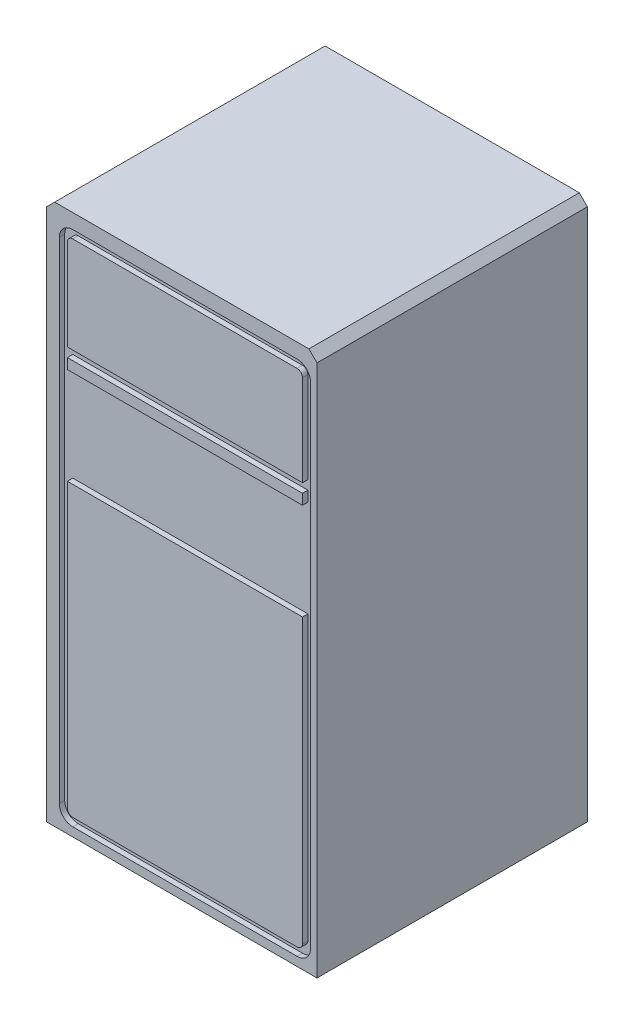
ISO-10303-21;
HEADER;
FILE_DESCRIPTION(('STEP AP214'),'2;1');
FILE_NAME('part.step','',(''),(''),'','','');
FILE_SCHEMA(('AUTOMOTIVE_DESIGN { 1 0 10303 214 1 1 1 1 }'));
ENDSEC;
DATA;
#1=APPLICATION_CONTEXT('core data for automotive mechanical design processes');
#2=APPLICATION_PROTOCOL_DEFINITION('international standard','automotive_design',2000,#1);
#3=PRODUCT_CONTEXT('',#1,'mechanical');
#4=PRODUCT('Part','Part','',(#3));
#5=PRODUCT_RELATED_PRODUCT_CATEGORY('part','',(#4));
#6=PRODUCT_DEFINITION_FORMATION('','',#4);
#7=PRODUCT_DEFINITION_CONTEXT('part definition',#1,'design');
#8=PRODUCT_DEFINITION('design','',#6,#7);
#9=PRODUCT_DEFINITION_SHAPE('','',#8);
#10=(LENGTH_UNIT() NAMED_UNIT(*) SI_UNIT(.MILLI.,.METRE.));
#11=(NAMED_UNIT(*) PLANE_ANGLE_UNIT() SI_UNIT($,.RADIAN.));
#12=(NAMED_UNIT(*) SI_UNIT($,.STERADIAN.) SOLID_ANGLE_UNIT());
#13=UNCERTAINTY_MEASURE_WITH_UNIT(LENGTH_MEASURE(1.E-05),#10,'distance_accuracy_value','');
#14=(GEOMETRIC_REPRESENTATION_CONTEXT(3) GLOBAL_UNCERTAINTY_ASSIGNED_CONTEXT((#13)) GLOBAL_UNIT_ASSIGNED_CONTEXT((#10,
#11,#12)) REPRESENTATION_CONTEXT('',''));
#15=CARTESIAN_POINT('',(0.,0.,0.));
#16=DIRECTION('',(0.,0.,1.));
#17=DIRECTION('',(1.,0.,0.));
#18=AXIS2_PLACEMENT_3D('',#15,#16,#17);
#19=CARTESIAN_POINT('',(446.238550510599,1895.51273196442,480.));
#20=DIRECTION('',(1.,0.,0.));
#21=DIRECTION('',(0.,1.,0.));
#22=AXIS2_PLACEMENT_3D('',#19,#20,#21);
#23=PLANE('',#22);
#24=DIRECTION('',(0.,0.,1.));
#25=VECTOR('',#24,1.);
#26=CARTESIAN_POINT('',(446.238550510599,1559.36179810981,480.));
#27=LINE('',#26,#25);
#28=CARTESIAN_POINT('',(446.238550510599,1559.36179810981,480.));
#29=VERTEX_POINT('',#28);
#30=CARTESIAN_POINT('',(446.238550510599,1559.36179810981,500.));
#31=VERTEX_POINT('',#30);
#32=EDGE_CURVE('E518',#29,#31,#27,.T.);
#33=ORIENTED_EDGE('',*,*,#32,.F.);
#34=DIRECTION('',(0.,1.,0.));
#35=VECTOR('',#34,1.);
#36=CARTESIAN_POINT('',(446.238550510599,1895.51273196442,480.));
#37=LINE('',#36,#35);
#38=CARTESIAN_POINT('',(446.238550510599,1895.51273196442,480.));
#39=VERTEX_POINT('',#38);
#40=EDGE_CURVE('E267',#29,#39,#37,.T.);
#41=ORIENTED_EDGE('',*,*,#40,.T.);
#42=DIRECTION('',(0.,0.,1.));
#43=VECTOR('',#42,1.);
#44=CARTESIAN_POINT('',(446.238550510599,1895.51273196442,480.));
#45=LINE('',#44,#43);
#46=CARTESIAN_POINT('',(446.238550510599,1895.51273196442,500.));
#47=VERTEX_POINT('',#46);
#48=EDGE_CURVE('E301',#39,#47,#45,.T.);
#49=ORIENTED_EDGE('',*,*,#48,.T.);
#50=DIRECTION('',(0.,1.,0.));
#51=VECTOR('',#50,1.);
#52=CARTESIAN_POINT('',(446.238550510599,1895.51273196442,500.));
#53=LINE('',#52,#51);
#54=EDGE_CURVE('E287',#31,#47,#53,.T.);
#55=ORIENTED_EDGE('',*,*,#54,.F.);
#56=EDGE_LOOP('',(#33,#41,#49,#55));
#57=FACE_BOUND('',#56,.T.);
#58=ADVANCED_FACE('F35',(#57),#23,.T.);
#59=CARTESIAN_POINT('',(-423.105485688733,1895.51273196442,480.));
#60=DIRECTION('',(-1.,0.,0.));
#61=DIRECTION('',(0.,-1.,0.));
#62=AXIS2_PLACEMENT_3D('',#59,#60,#61);
#63=PLANE('',#62);
#64=DIRECTION('',(0.,0.,1.));
#65=VECTOR('',#64,1.);
#66=CARTESIAN_POINT('',(-423.105485688733,1559.36179810981,480.));
#67=LINE('',#66,#65);
#68=CARTESIAN_POINT('',(-423.105485688733,1559.36179810981,480.));
#69=VERTEX_POINT('',#68);
#70=CARTESIAN_POINT('',(-423.105485688733,1559.36179810981,500.));
#71=VERTEX_POINT('',#70);
#72=EDGE_CURVE('E280',#69,#71,#67,.T.);
#73=ORIENTED_EDGE('',*,*,#72,.T.);
#74=DIRECTION('',(0.,-1.,0.));
#75=VECTOR('',#74,1.);
#76=CARTESIAN_POINT('',(-423.105485688733,1895.51273196442,500.));
#77=LINE('',#76,#75);
#78=CARTESIAN_POINT('',(-423.105485688733,1895.51273196442,500.));
#79=VERTEX_POINT('',#78);
#80=EDGE_CURVE('E281',#79,#71,#77,.T.);
#81=ORIENTED_EDGE('',*,*,#80,.F.);
#82=DIRECTION('',(0.,0.,1.));
#83=VECTOR('',#82,1.);
#84=CARTESIAN_POINT('',(-423.105485688733,1895.51273196442,480.));
#85=LINE('',#84,#83);
#86=CARTESIAN_POINT('',(-423.105485688733,1895.51273196442,480.));
#87=VERTEX_POINT('',#86);
#88=EDGE_CURVE('E276',#87,#79,#85,.T.);
#89=ORIENTED_EDGE('',*,*,#88,.F.);
#90=DIRECTION('',(0.,-1.,0.));
#91=VECTOR('',#90,1.);
#92=CARTESIAN_POINT('',(-423.105485688733,1895.51273196442,480.));
#93=LINE('',#92,#91);
#94=EDGE_CURVE('E258',#87,#69,#93,.T.);
#95=ORIENTED_EDGE('',*,*,#94,.T.);
#96=EDGE_LOOP('',(#73,#81,#89,#95));
#97=FACE_BOUND('',#96,.T.);
#98=ADVANCED_FACE('F490',(#97),#63,.T.);
#99=CARTESIAN_POINT('',(-500.,2000.,500.));
#100=DIRECTION('',(0.,0.,-1.));
#101=DIRECTION('',(-1.,0.,0.));
#102=AXIS2_PLACEMENT_3D('',#99,#100,#101);
#103=PLANE('',#102);
#104=ORIENTED_EDGE('',*,*,#80,.T.);
#105=DIRECTION('',(-1.,0.,0.));
#106=VECTOR('',#105,1.);
#107=CARTESIAN_POINT('',(-423.105485688733,1559.36179810981,500.));
#108=LINE('',#107,#106);
#109=EDGE_CURVE('E243',#31,#71,#108,.T.);
#110=ORIENTED_EDGE('',*,*,#109,.F.);
#111=ORIENTED_EDGE('',*,*,#54,.T.);
#112=CARTESIAN_POINT('',(426.238550510599,1895.51273196442,500.));
#113=DIRECTION('',(0.,0.,1.));
#114=DIRECTION('',(-1.,0.,0.));
#115=AXIS2_PLACEMENT_3D('',#112,#113,#114);
#116=CIRCLE('',#115,20.);
#117=CARTESIAN_POINT('',(426.238550510599,1915.51273196442,500.));
#118=VERTEX_POINT('',#117);
#119=EDGE_CURVE('E291',#47,#118,#116,.T.);
#120=ORIENTED_EDGE('',*,*,#119,.T.);
#121=DIRECTION('',(-1.,0.,0.));
#122=VECTOR('',#121,1.);
#123=CARTESIAN_POINT('',(-403.105485688733,1915.51273196442,500.));
#124=LINE('',#123,#122);
#125=CARTESIAN_POINT('',(-403.105485688733,1915.51273196442,500.));
#126=VERTEX_POINT('',#125);
#127=EDGE_CURVE('E263',#118,#126,#124,.T.);
#128=ORIENTED_EDGE('',*,*,#127,.T.);
#129=CARTESIAN_POINT('',(-403.105485688733,1895.51273196442,500.));
#130=DIRECTION('',(0.,0.,1.));
#131=DIRECTION('',(1.,0.,0.));
#132=AXIS2_PLACEMENT_3D('',#129,#130,#131);
#133=CIRCLE('',#132,20.);
#134=EDGE_CURVE('E277',#126,#79,#133,.T.);
#135=ORIENTED_EDGE('',*,*,#134,.T.);
#136=EDGE_LOOP('',(#104,#110,#111,#120,#128,#135));
#137=FACE_BOUND('',#136,.T.);
#138=ADVANCED_FACE('F483',(#137),#103,.F.);
#139=CARTESIAN_POINT('',(500.,2000.,-500.));
#140=DIRECTION('',(-1.,0.,0.));
#141=DIRECTION('',(0.,0.,1.));
#142=AXIS2_PLACEMENT_3D('',#139,#140,#141);
#143=PLANE('',#142);
#144=DIRECTION('',(0.,-1.,0.));
#145=VECTOR('',#144,1.);
#146=CARTESIAN_POINT('',(500.,2000.,-500.));
#147=LINE('',#146,#145);
#148=CARTESIAN_POINT('',(500.,1970.,-500.));
#149=VERTEX_POINT('',#148);
#150=CARTESIAN_POINT('',(500.,0.,-500.));
#151=VERTEX_POINT('',#150);
#152=EDGE_CURVE('E445',#149,#151,#147,.T.);
#153=ORIENTED_EDGE('',*,*,#152,.F.);
#154=DIRECTION('',(0.,0.,1.));
#155=VECTOR('',#154,1.);
#156=CARTESIAN_POINT('',(500.,1970.,500.));
#157=LINE('',#156,#155);
#158=CARTESIAN_POINT('',(500.,1970.,500.));
#159=VERTEX_POINT('',#158);
#160=EDGE_CURVE('E11',#149,#159,#157,.T.);
#161=ORIENTED_EDGE('',*,*,#160,.T.);
#162=DIRECTION('',(0.,-1.,0.));
#163=VECTOR('',#162,1.);
#164=CARTESIAN_POINT('',(500.,2000.,500.));
#165=LINE('',#164,#163);
#166=CARTESIAN_POINT('',(500.,0.,500.));
#167=VERTEX_POINT('',#166);
#168=EDGE_CURVE('E429',#159,#167,#165,.T.);
#169=ORIENTED_EDGE('',*,*,#168,.T.);
#170=DIRECTION('',(0.,0.,-1.));
#171=VECTOR('',#170,1.);
#172=CARTESIAN_POINT('',(500.,0.,-500.));
#173=LINE('',#172,#171);
#174=EDGE_CURVE('E407',#167,#151,#173,.T.);
#175=ORIENTED_EDGE('',*,*,#174,.T.);
#176=EDGE_LOOP('',(#153,#161,#169,#175));
#177=FACE_BOUND('',#176,.T.);
#178=ADVANCED_FACE('F481',(#177),#143,.F.);
#179=CARTESIAN_POINT('',(-500.,2000.,-500.));
#180=DIRECTION('',(0.,0.,1.));
#181=DIRECTION('',(1.,0.,0.));
#182=AXIS2_PLACEMENT_3D('',#179,#180,#181);
#183=PLANE('',#182);
#184=DIRECTION('',(0.,-1.,0.));
#185=VECTOR('',#184,1.);
#186=CARTESIAN_POINT('',(-500.,2000.,-500.));
#187=LINE('',#186,#185);
#188=CARTESIAN_POINT('',(-500.,1970.,-500.));
#189=VERTEX_POINT('',#188);
#190=CARTESIAN_POINT('',(-500.,0.,-500.));
#191=VERTEX_POINT('',#190);
#192=EDGE_CURVE('E443',#189,#191,#187,.T.);
#193=ORIENTED_EDGE('',*,*,#192,.F.);
#194=DIRECTION('',(0.707106781186545,0.70710678118655,0.));
#195=VECTOR('',#194,1.);
#196=CARTESIAN_POINT('',(-470.,2000.,-500.));
#197=LINE('',#196,#195);
#198=CARTESIAN_POINT('',(-470.,2000.,-500.));
#199=VERTEX_POINT('',#198);
#200=EDGE_CURVE('E43',#189,#199,#197,.T.);
#201=ORIENTED_EDGE('',*,*,#200,.T.);
#202=DIRECTION('',(-1.,0.,0.));
#203=VECTOR('',#202,1.);
#204=CARTESIAN_POINT('',(-500.,2000.,-500.));
#205=LINE('',#204,#203);
#206=CARTESIAN_POINT('',(470.,2000.,-500.));
#207=VERTEX_POINT('',#206);
#208=EDGE_CURVE('E422',#207,#199,#205,.T.);
#209=ORIENTED_EDGE('',*,*,#208,.F.);
#210=DIRECTION('',(0.707106781186545,-0.70710678118655,0.));
#211=VECTOR('',#210,1.);
#212=CARTESIAN_POINT('',(470.,2000.,-500.));
#213=LINE('',#212,#211);
#214=EDGE_CURVE('E50',#207,#149,#213,.T.);
#215=ORIENTED_EDGE('',*,*,#214,.T.);
#216=ORIENTED_EDGE('',*,*,#152,.T.);
#217=DIRECTION('',(-1.,0.,0.));
#218=VECTOR('',#217,1.);
#219=CARTESIAN_POINT('',(-500.,0.,-500.));
#220=LINE('',#219,#218);
#221=EDGE_CURVE('E432',#151,#191,#220,.T.);
#222=ORIENTED_EDGE('',*,*,#221,.T.);
#223=EDGE_LOOP('',(#193,#201,#209,#215,#216,#222));
#224=FACE_BOUND('',#223,.T.);
#225=ADVANCED_FACE('F459',(#224),#183,.F.);
#226=CARTESIAN_POINT('',(-500.,2000.,-500.));
#227=DIRECTION('',(1.,0.,0.));
#228=DIRECTION('',(0.,0.,-1.));
#229=AXIS2_PLACEMENT_3D('',#226,#227,#228);
#230=PLANE('',#229);
#231=DIRECTION('',(0.,-1.,0.));
#232=VECTOR('',#231,1.);
#233=CARTESIAN_POINT('',(-500.,2000.,500.));
#234=LINE('',#233,#232);
#235=CARTESIAN_POINT('',(-500.,1970.,500.));
#236=VERTEX_POINT('',#235);
#237=CARTESIAN_POINT('',(-500.,0.,500.));
#238=VERTEX_POINT('',#237);
#239=EDGE_CURVE('E441',#236,#238,#234,.T.);
#240=ORIENTED_EDGE('',*,*,#239,.F.);
#241=DIRECTION('',(0.,0.,-1.));
#242=VECTOR('',#241,1.);
#243=CARTESIAN_POINT('',(-500.,1970.,-500.));
#244=LINE('',#243,#242);
#245=EDGE_CURVE('E58',#236,#189,#244,.T.);
#246=ORIENTED_EDGE('',*,*,#245,.T.);
#247=ORIENTED_EDGE('',*,*,#192,.T.);
#248=DIRECTION('',(0.,0.,1.));
#249=VECTOR('',#248,1.);
#250=CARTESIAN_POINT('',(-500.,0.,-500.));
#251=LINE('',#250,#249);
#252=EDGE_CURVE('E435',#191,#238,#251,.T.);
#253=ORIENTED_EDGE('',*,*,#252,.T.);
#254=EDGE_LOOP('',(#240,#246,#247,#253));
#255=FACE_BOUND('',#254,.T.);
#256=ADVANCED_FACE('F469',(#255),#230,.F.);
#257=DIRECTION('',(0.,-1.,0.));
#258=VECTOR('',#257,1.);
#259=CARTESIAN_POINT('',(-453.105485688733,1895.51273196442,500.));
#260=LINE('',#259,#258);
#261=CARTESIAN_POINT('',(-453.105485688733,1895.51273196442,500.));
#262=VERTEX_POINT('',#261);
#263=CARTESIAN_POINT('',(-453.105485688733,82.6025015344469,500.));
#264=VERTEX_POINT('',#263);
#265=EDGE_CURVE('E385',#262,#264,#260,.T.);
#266=ORIENTED_EDGE('',*,*,#265,.F.);
#267=CARTESIAN_POINT('',(-403.105485688733,1895.51273196442,500.));
#268=DIRECTION('',(0.,0.,1.));
#269=DIRECTION('',(1.,0.,0.));
#270=AXIS2_PLACEMENT_3D('',#267,#268,#269);
#271=CIRCLE('',#270,50.);
#272=CARTESIAN_POINT('',(-403.105485688733,1945.51273196442,500.));
#273=VERTEX_POINT('',#272);
#274=EDGE_CURVE('E347',#273,#262,#271,.T.);
#275=ORIENTED_EDGE('',*,*,#274,.F.);
#276=DIRECTION('',(-1.,0.,0.));
#277=VECTOR('',#276,1.);
#278=CARTESIAN_POINT('',(-403.105485688733,1945.51273196442,500.));
#279=LINE('',#278,#277);
#280=CARTESIAN_POINT('',(426.238550510599,1945.51273196442,500.));
#281=VERTEX_POINT('',#280);
#282=EDGE_CURVE('E362',#281,#273,#279,.T.);
#283=ORIENTED_EDGE('',*,*,#282,.F.);
#284=CARTESIAN_POINT('',(426.238550510599,1895.51273196442,500.));
#285=DIRECTION('',(0.,0.,1.));
#286=DIRECTION('',(-1.,0.,0.));
#287=AXIS2_PLACEMENT_3D('',#284,#285,#286);
#288=CIRCLE('',#287,50.);
#289=CARTESIAN_POINT('',(476.238550510599,1895.51273196442,500.));
#290=VERTEX_POINT('',#289);
#291=EDGE_CURVE('E400',#290,#281,#288,.T.);
#292=ORIENTED_EDGE('',*,*,#291,.F.);
#293=DIRECTION('',(0.,1.,0.));
#294=VECTOR('',#293,1.);
#295=CARTESIAN_POINT('',(476.238550510599,1895.51273196442,500.));
#296=LINE('',#295,#294);
#297=CARTESIAN_POINT('',(476.238550510599,82.6025015344469,500.));
#298=VERTEX_POINT('',#297);
#299=EDGE_CURVE('E397',#298,#290,#296,.T.);
#300=ORIENTED_EDGE('',*,*,#299,.F.);
#301=CARTESIAN_POINT('',(426.238550510599,82.6025015344469,500.));
#302=DIRECTION('',(0.,0.,1.));
#303=DIRECTION('',(1.,0.,0.));
#304=AXIS2_PLACEMENT_3D('',#301,#302,#303);
#305=CIRCLE('',#304,50.);
#306=CARTESIAN_POINT('',(426.238550510599,32.6025015344469,500.));
#307=VERTEX_POINT('',#306);
#308=EDGE_CURVE('E394',#307,#298,#305,.T.);
#309=ORIENTED_EDGE('',*,*,#308,.F.);
#310=DIRECTION('',(1.,0.,0.));
#311=VECTOR('',#310,1.);
#312=CARTESIAN_POINT('',(-403.105485688733,32.6025015344468,500.));
#313=LINE('',#312,#311);
#314=CARTESIAN_POINT('',(-403.105485688733,32.6025015344468,500.));
#315=VERTEX_POINT('',#314);
#316=EDGE_CURVE('E391',#315,#307,#313,.T.);
#317=ORIENTED_EDGE('',*,*,#316,.F.);
#318=CARTESIAN_POINT('',(-403.105485688733,82.6025015344469,500.));
#319=DIRECTION('',(0.,0.,1.));
#320=DIRECTION('',(1.,0.,0.));
#321=AXIS2_PLACEMENT_3D('',#318,#319,#320);
#322=CIRCLE('',#321,50.);
#323=EDGE_CURVE('E388',#264,#315,#322,.T.);
#324=ORIENTED_EDGE('',*,*,#323,.F.);
#325=EDGE_LOOP('',(#266,#275,#283,#292,#300,#309,#317,#324));
#326=FACE_BOUND('',#325,.T.);
#327=DIRECTION('',(1.,0.,0.));
#328=VECTOR('',#327,1.);
#329=CARTESIAN_POINT('',(-500.,2000.,500.));
#330=LINE('',#329,#328);
#331=CARTESIAN_POINT('',(-470.,2000.,500.));
#332=VERTEX_POINT('',#331);
#333=CARTESIAN_POINT('',(470.,2000.,500.));
#334=VERTEX_POINT('',#333);
#335=EDGE_CURVE('E425',#332,#334,#330,.T.);
#336=ORIENTED_EDGE('',*,*,#335,.F.);
#337=DIRECTION('',(-0.707106781186545,-0.70710678118655,0.));
#338=VECTOR('',#337,1.);
#339=CARTESIAN_POINT('',(-470.,2000.,500.));
#340=LINE('',#339,#338);
#341=EDGE_CURVE('E455',#332,#236,#340,.T.);
#342=ORIENTED_EDGE('',*,*,#341,.T.);
#343=ORIENTED_EDGE('',*,*,#239,.T.);
#344=DIRECTION('',(1.,0.,0.));
#345=VECTOR('',#344,1.);
#346=CARTESIAN_POINT('',(-500.,0.,500.));
#347=LINE('',#346,#345);
#348=EDGE_CURVE('E426',#238,#167,#347,.T.);
#349=ORIENTED_EDGE('',*,*,#348,.T.);
#350=ORIENTED_EDGE('',*,*,#168,.F.);
#351=DIRECTION('',(-0.707106781186545,0.70710678118655,0.));
#352=VECTOR('',#351,1.);
#353=CARTESIAN_POINT('',(470.,2000.,500.));
#354=LINE('',#353,#352);
#355=EDGE_CURVE('E453',#159,#334,#354,.T.);
#356=ORIENTED_EDGE('',*,*,#355,.T.);
#357=EDGE_LOOP('',(#336,#342,#343,#349,#350,#356));
#358=FACE_BOUND('',#357,.T.);
#359=ADVANCED_FACE('F468',(#326,#358),#103,.F.);
#360=CARTESIAN_POINT('',(0.,2000.,0.));
#361=DIRECTION('',(0.,1.,0.));
#362=DIRECTION('',(0.,0.,1.));
#363=AXIS2_PLACEMENT_3D('',#360,#361,#362);
#364=PLANE('',#363);
#365=ORIENTED_EDGE('',*,*,#208,.T.);
#366=DIRECTION('',(0.,0.,1.));
#367=VECTOR('',#366,1.);
#368=CARTESIAN_POINT('',(-470.,2000.,500.));
#369=LINE('',#368,#367);
#370=EDGE_CURVE('E450',#199,#332,#369,.T.);
#371=ORIENTED_EDGE('',*,*,#370,.T.);
#372=ORIENTED_EDGE('',*,*,#335,.T.);
#373=DIRECTION('',(0.,0.,-1.));
#374=VECTOR('',#373,1.);
#375=CARTESIAN_POINT('',(470.,2000.,-500.));
#376=LINE('',#375,#374);
#377=EDGE_CURVE('E447',#334,#207,#376,.T.);
#378=ORIENTED_EDGE('',*,*,#377,.T.);
#379=EDGE_LOOP('',(#365,#371,#372,#378));
#380=FACE_BOUND('',#379,.T.);
#381=ADVANCED_FACE('F463',(#380),#364,.T.);
#382=CARTESIAN_POINT('',(0.,0.,0.));
#383=DIRECTION('',(0.,1.,0.));
#384=DIRECTION('',(0.,0.,1.));
#385=AXIS2_PLACEMENT_3D('',#382,#383,#384);
#386=PLANE('',#385);
#387=ORIENTED_EDGE('',*,*,#174,.F.);
#388=ORIENTED_EDGE('',*,*,#348,.F.);
#389=ORIENTED_EDGE('',*,*,#252,.F.);
#390=ORIENTED_EDGE('',*,*,#221,.F.);
#391=EDGE_LOOP('',(#387,#388,#389,#390));
#392=FACE_BOUND('',#391,.T.);
#393=ADVANCED_FACE('F475',(#392),#386,.F.);
#394=CARTESIAN_POINT('',(-403.105485688733,1895.51273196442,480.));
#395=DIRECTION('',(0.,0.,1.));
#396=DIRECTION('',(1.,0.,0.));
#397=AXIS2_PLACEMENT_3D('',#394,#395,#396);
#398=CYLINDRICAL_SURFACE('',#397,50.);
#399=ORIENTED_EDGE('',*,*,#274,.T.);
#400=DIRECTION('',(0.,0.,1.));
#401=VECTOR('',#400,1.);
#402=CARTESIAN_POINT('',(-453.105485688733,1895.51273196442,480.));
#403=LINE('',#402,#401);
#404=CARTESIAN_POINT('',(-453.105485688733,1895.51273196442,480.));
#405=VERTEX_POINT('',#404);
#406=EDGE_CURVE('E383',#405,#262,#403,.T.);
#407=ORIENTED_EDGE('',*,*,#406,.F.);
#408=CARTESIAN_POINT('',(-403.105485688733,1895.51273196442,480.));
#409=DIRECTION('',(0.,0.,1.));
#410=DIRECTION('',(1.,0.,0.));
#411=AXIS2_PLACEMENT_3D('',#408,#409,#410);
#412=CIRCLE('',#411,50.);
#413=CARTESIAN_POINT('',(-403.105485688733,1945.51273196442,480.));
#414=VERTEX_POINT('',#413);
#415=EDGE_CURVE('E358',#414,#405,#412,.T.);
#416=ORIENTED_EDGE('',*,*,#415,.F.);
#417=DIRECTION('',(0.,0.,1.));
#418=VECTOR('',#417,1.);
#419=CARTESIAN_POINT('',(-403.105485688733,1945.51273196442,480.));
#420=LINE('',#419,#418);
#421=EDGE_CURVE('E405',#414,#273,#420,.T.);
#422=ORIENTED_EDGE('',*,*,#421,.T.);
#423=EDGE_LOOP('',(#399,#407,#416,#422));
#424=FACE_BOUND('',#423,.T.);
#425=ADVANCED_FACE('F569',(#424),#398,.F.);
#426=CARTESIAN_POINT('',(-403.105485688733,1945.51273196442,480.));
#427=DIRECTION('',(0.,1.,0.));
#428=DIRECTION('',(0.,0.,1.));
#429=AXIS2_PLACEMENT_3D('',#426,#427,#428);
#430=PLANE('',#429);
#431=ORIENTED_EDGE('',*,*,#282,.T.);
#432=ORIENTED_EDGE('',*,*,#421,.F.);
#433=DIRECTION('',(-1.,0.,0.));
#434=VECTOR('',#433,1.);
#435=CARTESIAN_POINT('',(-403.105485688733,1945.51273196442,480.));
#436=LINE('',#435,#434);
#437=CARTESIAN_POINT('',(426.238550510599,1945.51273196442,480.));
#438=VERTEX_POINT('',#437);
#439=EDGE_CURVE('E380',#438,#414,#436,.T.);
#440=ORIENTED_EDGE('',*,*,#439,.F.);
#441=DIRECTION('',(0.,0.,1.));
#442=VECTOR('',#441,1.);
#443=CARTESIAN_POINT('',(426.238550510599,1945.51273196442,480.));
#444=LINE('',#443,#442);
#445=EDGE_CURVE('E408',#438,#281,#444,.T.);
#446=ORIENTED_EDGE('',*,*,#445,.T.);
#447=EDGE_LOOP('',(#431,#432,#440,#446));
#448=FACE_BOUND('',#447,.T.);
#449=ADVANCED_FACE('F565',(#448),#430,.F.);
#450=CARTESIAN_POINT('',(426.238550510599,1895.51273196442,480.));
#451=DIRECTION('',(0.,0.,1.));
#452=DIRECTION('',(1.,0.,0.));
#453=AXIS2_PLACEMENT_3D('',#450,#451,#452);
#454=CYLINDRICAL_SURFACE('',#453,50.);
#455=ORIENTED_EDGE('',*,*,#291,.T.);
#456=ORIENTED_EDGE('',*,*,#445,.F.);
#457=CARTESIAN_POINT('',(426.238550510599,1895.51273196442,480.));
#458=DIRECTION('',(0.,0.,1.));
#459=DIRECTION('',(-1.,0.,0.));
#460=AXIS2_PLACEMENT_3D('',#457,#458,#459);
#461=CIRCLE('',#460,50.);
#462=CARTESIAN_POINT('',(476.238550510599,1895.51273196442,480.));
#463=VERTEX_POINT('',#462);
#464=EDGE_CURVE('E377',#463,#438,#461,.T.);
#465=ORIENTED_EDGE('',*,*,#464,.F.);
#466=DIRECTION('',(0.,0.,1.));
#467=VECTOR('',#466,1.);
#468=CARTESIAN_POINT('',(476.238550510599,1895.51273196442,480.));
#469=LINE('',#468,#467);
#470=EDGE_CURVE('E410',#463,#290,#469,.T.);
#471=ORIENTED_EDGE('',*,*,#470,.T.);
#472=EDGE_LOOP('',(#455,#456,#465,#471));
#473=FACE_BOUND('',#472,.T.);
#474=ADVANCED_FACE('F568',(#473),#454,.F.);
#475=CARTESIAN_POINT('',(476.238550510599,1895.51273196442,480.));
#476=DIRECTION('',(1.,0.,0.));
#477=DIRECTION('',(0.,1.,0.));
#478=AXIS2_PLACEMENT_3D('',#475,#476,#477);
#479=PLANE('',#478);
#480=ORIENTED_EDGE('',*,*,#299,.T.);
#481=ORIENTED_EDGE('',*,*,#470,.F.);
#482=DIRECTION('',(0.,1.,0.));
#483=VECTOR('',#482,1.);
#484=CARTESIAN_POINT('',(476.238550510599,1895.51273196442,480.));
#485=LINE('',#484,#483);
#486=CARTESIAN_POINT('',(476.238550510599,82.6025015344469,480.));
#487=VERTEX_POINT('',#486);
#488=EDGE_CURVE('E374',#487,#463,#485,.T.);
#489=ORIENTED_EDGE('',*,*,#488,.F.);
#490=DIRECTION('',(0.,0.,1.));
#491=VECTOR('',#490,1.);
#492=CARTESIAN_POINT('',(476.238550510599,82.6025015344469,480.));
#493=LINE('',#492,#491);
#494=EDGE_CURVE('E412',#487,#298,#493,.T.);
#495=ORIENTED_EDGE('',*,*,#494,.T.);
#496=EDGE_LOOP('',(#480,#481,#489,#495));
#497=FACE_BOUND('',#496,.T.);
#498=ADVANCED_FACE('F573',(#497),#479,.F.);
#499=CARTESIAN_POINT('',(426.238550510599,82.6025015344469,480.));
#500=DIRECTION('',(0.,0.,1.));
#501=DIRECTION('',(1.,0.,0.));
#502=AXIS2_PLACEMENT_3D('',#499,#500,#501);
#503=CYLINDRICAL_SURFACE('',#502,50.);
#504=ORIENTED_EDGE('',*,*,#308,.T.);
#505=ORIENTED_EDGE('',*,*,#494,.F.);
#506=CARTESIAN_POINT('',(426.238550510599,82.6025015344469,480.));
#507=DIRECTION('',(0.,0.,1.));
#508=DIRECTION('',(1.,0.,0.));
#509=AXIS2_PLACEMENT_3D('',#506,#507,#508);
#510=CIRCLE('',#509,50.);
#511=CARTESIAN_POINT('',(426.238550510599,32.6025015344469,480.));
#512=VERTEX_POINT('',#511);
#513=EDGE_CURVE('E371',#512,#487,#510,.T.);
#514=ORIENTED_EDGE('',*,*,#513,.F.);
#515=DIRECTION('',(0.,0.,1.));
#516=VECTOR('',#515,1.);
#517=CARTESIAN_POINT('',(426.238550510599,32.6025015344469,480.));
#518=LINE('',#517,#516);
#519=EDGE_CURVE('E414',#512,#307,#518,.T.);
#520=ORIENTED_EDGE('',*,*,#519,.T.);
#521=EDGE_LOOP('',(#504,#505,#514,#520));
#522=FACE_BOUND('',#521,.T.);
#523=ADVANCED_FACE('F577',(#522),#503,.F.);
#524=CARTESIAN_POINT('',(-403.105485688733,32.6025015344468,480.));
#525=DIRECTION('',(0.,-1.,0.));
#526=DIRECTION('',(1.,0.,0.));
#527=AXIS2_PLACEMENT_3D('',#524,#525,#526);
#528=PLANE('',#527);
#529=ORIENTED_EDGE('',*,*,#316,.T.);
#530=ORIENTED_EDGE('',*,*,#519,.F.);
#531=DIRECTION('',(1.,0.,0.));
#532=VECTOR('',#531,1.);
#533=CARTESIAN_POINT('',(-403.105485688733,32.6025015344468,480.));
#534=LINE('',#533,#532);
#535=CARTESIAN_POINT('',(-403.105485688733,32.6025015344468,480.));
#536=VERTEX_POINT('',#535);
#537=EDGE_CURVE('E368',#536,#512,#534,.T.);
#538=ORIENTED_EDGE('',*,*,#537,.F.);
#539=DIRECTION('',(0.,0.,1.));
#540=VECTOR('',#539,1.);
#541=CARTESIAN_POINT('',(-403.105485688733,32.6025015344468,480.));
#542=LINE('',#541,#540);
#543=EDGE_CURVE('E416',#536,#315,#542,.T.);
#544=ORIENTED_EDGE('',*,*,#543,.T.);
#545=EDGE_LOOP('',(#529,#530,#538,#544));
#546=FACE_BOUND('',#545,.T.);
#547=ADVANCED_FACE('F581',(#546),#528,.F.);
#548=CARTESIAN_POINT('',(-403.105485688733,82.6025015344469,480.));
#549=DIRECTION('',(0.,0.,1.));
#550=DIRECTION('',(1.,0.,0.));
#551=AXIS2_PLACEMENT_3D('',#548,#549,#550);
#552=CYLINDRICAL_SURFACE('',#551,50.);
#553=ORIENTED_EDGE('',*,*,#323,.T.);
#554=ORIENTED_EDGE('',*,*,#543,.F.);
#555=CARTESIAN_POINT('',(-403.105485688733,82.6025015344469,480.));
#556=DIRECTION('',(0.,0.,1.));
#557=DIRECTION('',(1.,0.,0.));
#558=AXIS2_PLACEMENT_3D('',#555,#556,#557);
#559=CIRCLE('',#558,50.);
#560=CARTESIAN_POINT('',(-453.105485688733,82.6025015344469,480.));
#561=VERTEX_POINT('',#560);
#562=EDGE_CURVE('E365',#561,#536,#559,.T.);
#563=ORIENTED_EDGE('',*,*,#562,.F.);
#564=DIRECTION('',(0.,0.,1.));
#565=VECTOR('',#564,1.);
#566=CARTESIAN_POINT('',(-453.105485688733,82.6025015344469,480.));
#567=LINE('',#566,#565);
#568=EDGE_CURVE('E418',#561,#264,#567,.T.);
#569=ORIENTED_EDGE('',*,*,#568,.T.);
#570=EDGE_LOOP('',(#553,#554,#563,#569));
#571=FACE_BOUND('',#570,.T.);
#572=ADVANCED_FACE('F560',(#571),#552,.F.);
#573=CARTESIAN_POINT('',(-453.105485688733,1895.51273196442,480.));
#574=DIRECTION('',(-1.,0.,0.));
#575=DIRECTION('',(0.,0.,1.));
#576=AXIS2_PLACEMENT_3D('',#573,#574,#575);
#577=PLANE('',#576);
#578=ORIENTED_EDGE('',*,*,#265,.T.);
#579=ORIENTED_EDGE('',*,*,#568,.F.);
#580=DIRECTION('',(0.,-1.,0.));
#581=VECTOR('',#580,1.);
#582=CARTESIAN_POINT('',(-453.105485688733,1895.51273196442,480.));
#583=LINE('',#582,#581);
#584=EDGE_CURVE('E361',#405,#561,#583,.T.);
#585=ORIENTED_EDGE('',*,*,#584,.F.);
#586=ORIENTED_EDGE('',*,*,#406,.T.);
#587=EDGE_LOOP('',(#578,#579,#585,#586));
#588=FACE_BOUND('',#587,.T.);
#589=ADVANCED_FACE('F551',(#588),#577,.F.);
#590=CARTESIAN_POINT('',(-403.105485688733,1895.51273196442,480.));
#591=DIRECTION('',(0.,0.,1.));
#592=DIRECTION('',(1.,0.,0.));
#593=AXIS2_PLACEMENT_3D('',#590,#591,#592);
#594=PLANE('',#593);
#595=ORIENTED_EDGE('',*,*,#40,.F.);
#596=DIRECTION('',(-1.,0.,0.));
#597=VECTOR('',#596,1.);
#598=CARTESIAN_POINT('',(-423.105485688733,1559.36179810981,480.));
#599=LINE('',#598,#597);
#600=EDGE_CURVE('E242',#29,#69,#599,.T.);
#601=ORIENTED_EDGE('',*,*,#600,.T.);
#602=ORIENTED_EDGE('',*,*,#94,.F.);
#603=CARTESIAN_POINT('',(-403.105485688733,1895.51273196442,480.));
#604=DIRECTION('',(0.,0.,1.));
#605=DIRECTION('',(1.,0.,0.));
#606=AXIS2_PLACEMENT_3D('',#603,#604,#605);
#607=CIRCLE('',#606,20.);
#608=CARTESIAN_POINT('',(-403.105485688733,1915.51273196442,480.));
#609=VERTEX_POINT('',#608);
#610=EDGE_CURVE('E259',#609,#87,#607,.T.);
#611=ORIENTED_EDGE('',*,*,#610,.F.);
#612=DIRECTION('',(-1.,0.,0.));
#613=VECTOR('',#612,1.);
#614=CARTESIAN_POINT('',(-403.105485688733,1915.51273196442,480.));
#615=LINE('',#614,#613);
#616=CARTESIAN_POINT('',(426.238550510599,1915.51273196442,480.));
#617=VERTEX_POINT('',#616);
#618=EDGE_CURVE('E273',#617,#609,#615,.T.);
#619=ORIENTED_EDGE('',*,*,#618,.F.);
#620=CARTESIAN_POINT('',(426.238550510599,1895.51273196442,480.));
#621=DIRECTION('',(0.,0.,1.));
#622=DIRECTION('',(-1.,0.,0.));
#623=AXIS2_PLACEMENT_3D('',#620,#621,#622);
#624=CIRCLE('',#623,20.);
#625=EDGE_CURVE('E270',#39,#617,#624,.T.);
#626=ORIENTED_EDGE('',*,*,#625,.F.);
#627=EDGE_LOOP('',(#595,#601,#602,#611,#619,#626));
#628=FACE_BOUND('',#627,.T.);
#629=DIRECTION('',(1.,0.,0.));
#630=VECTOR('',#629,1.);
#631=CARTESIAN_POINT('',(446.238550510599,1525.58901029941,480.));
#632=LINE('',#631,#630);
#633=CARTESIAN_POINT('',(-423.105485688733,1525.58901029941,480.));
#634=VERTEX_POINT('',#633);
#635=CARTESIAN_POINT('',(446.238550510599,1525.58901029941,480.));
#636=VERTEX_POINT('',#635);
#637=EDGE_CURVE('E231',#634,#636,#632,.T.);
#638=ORIENTED_EDGE('',*,*,#637,.T.);
#639=CARTESIAN_POINT('',(446.238550510599,1487.15617354025,480.));
#640=VERTEX_POINT('',#639);
#641=EDGE_CURVE('E268',#640,#636,#37,.T.);
#642=ORIENTED_EDGE('',*,*,#641,.F.);
#643=DIRECTION('',(1.,0.,0.));
#644=VECTOR('',#643,1.);
#645=CARTESIAN_POINT('',(446.238550510599,1487.15617354025,480.));
#646=LINE('',#645,#644);
#647=CARTESIAN_POINT('',(-423.105485688733,1487.15617354025,480.));
#648=VERTEX_POINT('',#647);
#649=EDGE_CURVE('E256',#648,#640,#646,.T.);
#650=ORIENTED_EDGE('',*,*,#649,.F.);
#651=EDGE_CURVE('E249',#634,#648,#93,.T.);
#652=ORIENTED_EDGE('',*,*,#651,.F.);
#653=EDGE_LOOP('',(#638,#642,#650,#652));
#654=FACE_BOUND('',#653,.T.);
#655=DIRECTION('',(0.,-1.,0.));
#656=VECTOR('',#655,1.);
#657=CARTESIAN_POINT('',(-423.105485688733,1129.44844519169,480.));
#658=LINE('',#657,#656);
#659=CARTESIAN_POINT('',(-423.105485688733,1129.44844519169,480.));
#660=VERTEX_POINT('',#659);
#661=CARTESIAN_POINT('',(-423.105485688733,82.602501534447,480.));
#662=VERTEX_POINT('',#661);
#663=EDGE_CURVE('E325',#660,#662,#658,.T.);
#664=ORIENTED_EDGE('',*,*,#663,.F.);
#665=DIRECTION('',(-1.,0.,0.));
#666=VECTOR('',#665,1.);
#667=CARTESIAN_POINT('',(-423.105485688733,1129.44844519169,480.));
#668=LINE('',#667,#666);
#669=CARTESIAN_POINT('',(446.238550510599,1129.44844519169,480.));
#670=VERTEX_POINT('',#669);
#671=EDGE_CURVE('E322',#670,#660,#668,.T.);
#672=ORIENTED_EDGE('',*,*,#671,.F.);
#673=DIRECTION('',(0.,1.,0.));
#674=VECTOR('',#673,1.);
#675=CARTESIAN_POINT('',(446.238550510599,1129.44844519169,480.));
#676=LINE('',#675,#674);
#677=CARTESIAN_POINT('',(446.238550510599,82.6025015344469,480.));
#678=VERTEX_POINT('',#677);
#679=EDGE_CURVE('E319',#678,#670,#676,.T.);
#680=ORIENTED_EDGE('',*,*,#679,.F.);
#681=CARTESIAN_POINT('',(426.238550510599,82.6025015344469,480.));
#682=DIRECTION('',(0.,0.,1.));
#683=DIRECTION('',(1.,0.,0.));
#684=AXIS2_PLACEMENT_3D('',#681,#682,#683);
#685=CIRCLE('',#684,20.);
#686=CARTESIAN_POINT('',(426.238550510599,62.602501534447,480.));
#687=VERTEX_POINT('',#686);
#688=EDGE_CURVE('E316',#687,#678,#685,.T.);
#689=ORIENTED_EDGE('',*,*,#688,.F.);
#690=DIRECTION('',(1.,0.,0.));
#691=VECTOR('',#690,1.);
#692=CARTESIAN_POINT('',(-403.105485688733,62.6025015344469,480.));
#693=LINE('',#692,#691);
#694=CARTESIAN_POINT('',(-403.105485688733,62.6025015344469,480.));
#695=VERTEX_POINT('',#694);
#696=EDGE_CURVE('E312',#695,#687,#693,.T.);
#697=ORIENTED_EDGE('',*,*,#696,.F.);
#698=CARTESIAN_POINT('',(-403.105485688733,82.6025015344469,480.));
#699=DIRECTION('',(0.,0.,1.));
#700=DIRECTION('',(1.,0.,0.));
#701=AXIS2_PLACEMENT_3D('',#698,#699,#700);
#702=CIRCLE('',#701,20.);
#703=EDGE_CURVE('E309',#662,#695,#702,.T.);
#704=ORIENTED_EDGE('',*,*,#703,.F.);
#705=EDGE_LOOP('',(#664,#672,#680,#689,#697,#704));
#706=FACE_BOUND('',#705,.T.);
#707=ORIENTED_EDGE('',*,*,#415,.T.);
#708=ORIENTED_EDGE('',*,*,#584,.T.);
#709=ORIENTED_EDGE('',*,*,#562,.T.);
#710=ORIENTED_EDGE('',*,*,#537,.T.);
#711=ORIENTED_EDGE('',*,*,#513,.T.);
#712=ORIENTED_EDGE('',*,*,#488,.T.);
#713=ORIENTED_EDGE('',*,*,#464,.T.);
#714=ORIENTED_EDGE('',*,*,#439,.T.);
#715=EDGE_LOOP('',(#707,#708,#709,#710,#711,#712,#713,#714));
#716=FACE_BOUND('',#715,.T.);
#717=ADVANCED_FACE('F253',(#628,#654,#706,#716),#594,.T.);
#718=CARTESIAN_POINT('',(-403.105485688733,82.6025015344469,480.));
#719=DIRECTION('',(0.,0.,1.));
#720=DIRECTION('',(1.,0.,0.));
#721=AXIS2_PLACEMENT_3D('',#718,#719,#720);
#722=CYLINDRICAL_SURFACE('',#721,20.);
#723=CARTESIAN_POINT('',(-403.105485688733,82.6025015344469,500.));
#724=DIRECTION('',(0.,0.,1.));
#725=DIRECTION('',(1.,0.,0.));
#726=AXIS2_PLACEMENT_3D('',#723,#724,#725);
#727=CIRCLE('',#726,20.);
#728=CARTESIAN_POINT('',(-423.105485688733,82.602501534447,500.));
#729=VERTEX_POINT('',#728);
#730=CARTESIAN_POINT('',(-403.105485688733,62.6025015344469,500.));
#731=VERTEX_POINT('',#730);
#732=EDGE_CURVE('E298',#729,#731,#727,.T.);
#733=ORIENTED_EDGE('',*,*,#732,.F.);
#734=DIRECTION('',(0.,0.,1.));
#735=VECTOR('',#734,1.);
#736=CARTESIAN_POINT('',(-423.105485688733,82.602501534447,480.));
#737=LINE('',#736,#735);
#738=EDGE_CURVE('E345',#662,#729,#737,.T.);
#739=ORIENTED_EDGE('',*,*,#738,.F.);
#740=ORIENTED_EDGE('',*,*,#703,.T.);
#741=DIRECTION('',(0.,0.,1.));
#742=VECTOR('',#741,1.);
#743=CARTESIAN_POINT('',(-403.105485688733,62.6025015344469,480.));
#744=LINE('',#743,#742);
#745=EDGE_CURVE('E328',#695,#731,#744,.T.);
#746=ORIENTED_EDGE('',*,*,#745,.T.);
#747=EDGE_LOOP('',(#733,#739,#740,#746));
#748=FACE_BOUND('',#747,.T.);
#749=ADVANCED_FACE('F550',(#748),#722,.T.);
#750=CARTESIAN_POINT('',(-423.105485688733,1129.44844519169,480.));
#751=DIRECTION('',(-1.,0.,0.));
#752=DIRECTION('',(0.,-1.,0.));
#753=AXIS2_PLACEMENT_3D('',#750,#751,#752);
#754=PLANE('',#753);
#755=DIRECTION('',(0.,-1.,0.));
#756=VECTOR('',#755,1.);
#757=CARTESIAN_POINT('',(-423.105485688733,1129.44844519169,500.));
#758=LINE('',#757,#756);
#759=CARTESIAN_POINT('',(-423.105485688733,1129.44844519169,500.));
#760=VERTEX_POINT('',#759);
#761=EDGE_CURVE('E313',#760,#729,#758,.T.);
#762=ORIENTED_EDGE('',*,*,#761,.F.);
#763=DIRECTION('',(0.,0.,1.));
#764=VECTOR('',#763,1.);
#765=CARTESIAN_POINT('',(-423.105485688733,1129.44844519169,480.));
#766=LINE('',#765,#764);
#767=EDGE_CURVE('E348',#660,#760,#766,.T.);
#768=ORIENTED_EDGE('',*,*,#767,.F.);
#769=ORIENTED_EDGE('',*,*,#663,.T.);
#770=ORIENTED_EDGE('',*,*,#738,.T.);
#771=EDGE_LOOP('',(#762,#768,#769,#770));
#772=FACE_BOUND('',#771,.T.);
#773=ADVANCED_FACE('F557',(#772),#754,.T.);
#774=CARTESIAN_POINT('',(-423.105485688733,1129.44844519169,480.));
#775=DIRECTION('',(0.,1.,0.));
#776=DIRECTION('',(0.,0.,1.));
#777=AXIS2_PLACEMENT_3D('',#774,#775,#776);
#778=PLANE('',#777);
#779=DIRECTION('',(-1.,0.,0.));
#780=VECTOR('',#779,1.);
#781=CARTESIAN_POINT('',(-423.105485688733,1129.44844519169,500.));
#782=LINE('',#781,#780);
#783=CARTESIAN_POINT('',(446.238550510599,1129.44844519169,500.));
#784=VERTEX_POINT('',#783);
#785=EDGE_CURVE('E340',#784,#760,#782,.T.);
#786=ORIENTED_EDGE('',*,*,#785,.F.);
#787=DIRECTION('',(0.,0.,1.));
#788=VECTOR('',#787,1.);
#789=CARTESIAN_POINT('',(446.238550510599,1129.44844519169,480.));
#790=LINE('',#789,#788);
#791=EDGE_CURVE('E350',#670,#784,#790,.T.);
#792=ORIENTED_EDGE('',*,*,#791,.F.);
#793=ORIENTED_EDGE('',*,*,#671,.T.);
#794=ORIENTED_EDGE('',*,*,#767,.T.);
#795=EDGE_LOOP('',(#786,#792,#793,#794));
#796=FACE_BOUND('',#795,.T.);
#797=ADVANCED_FACE('F665',(#796),#778,.T.);
#798=CARTESIAN_POINT('',(446.238550510599,1129.44844519169,480.));
#799=DIRECTION('',(1.,0.,0.));
#800=DIRECTION('',(0.,1.,0.));
#801=AXIS2_PLACEMENT_3D('',#798,#799,#800);
#802=PLANE('',#801);
#803=DIRECTION('',(0.,1.,0.));
#804=VECTOR('',#803,1.);
#805=CARTESIAN_POINT('',(446.238550510599,1129.44844519169,500.));
#806=LINE('',#805,#804);
#807=CARTESIAN_POINT('',(446.238550510599,82.6025015344469,500.));
#808=VERTEX_POINT('',#807);
#809=EDGE_CURVE('E337',#808,#784,#806,.T.);
#810=ORIENTED_EDGE('',*,*,#809,.F.);
#811=DIRECTION('',(0.,0.,1.));
#812=VECTOR('',#811,1.);
#813=CARTESIAN_POINT('',(446.238550510599,82.6025015344469,480.));
#814=LINE('',#813,#812);
#815=EDGE_CURVE('E352',#678,#808,#814,.T.);
#816=ORIENTED_EDGE('',*,*,#815,.F.);
#817=ORIENTED_EDGE('',*,*,#679,.T.);
#818=ORIENTED_EDGE('',*,*,#791,.T.);
#819=EDGE_LOOP('',(#810,#816,#817,#818));
#820=FACE_BOUND('',#819,.T.);
#821=ADVANCED_FACE('F675',(#820),#802,.T.);
#822=CARTESIAN_POINT('',(426.238550510599,82.6025015344469,480.));
#823=DIRECTION('',(0.,0.,1.));
#824=DIRECTION('',(1.,0.,0.));
#825=AXIS2_PLACEMENT_3D('',#822,#823,#824);
#826=CYLINDRICAL_SURFACE('',#825,20.);
#827=CARTESIAN_POINT('',(426.238550510599,82.6025015344469,500.));
#828=DIRECTION('',(0.,0.,1.));
#829=DIRECTION('',(1.,0.,0.));
#830=AXIS2_PLACEMENT_3D('',#827,#828,#829);
#831=CIRCLE('',#830,20.);
#832=CARTESIAN_POINT('',(426.238550510599,62.602501534447,500.));
#833=VERTEX_POINT('',#832);
#834=EDGE_CURVE('E334',#833,#808,#831,.T.);
#835=ORIENTED_EDGE('',*,*,#834,.F.);
#836=DIRECTION('',(0.,0.,1.));
#837=VECTOR('',#836,1.);
#838=CARTESIAN_POINT('',(426.238550510599,62.6025015344469,480.));
#839=LINE('',#838,#837);
#840=EDGE_CURVE('E354',#687,#833,#839,.T.);
#841=ORIENTED_EDGE('',*,*,#840,.F.);
#842=ORIENTED_EDGE('',*,*,#688,.T.);
#843=ORIENTED_EDGE('',*,*,#815,.T.);
#844=EDGE_LOOP('',(#835,#841,#842,#843));
#845=FACE_BOUND('',#844,.T.);
#846=ADVANCED_FACE('F685',(#845),#826,.T.);
#847=CARTESIAN_POINT('',(-403.105485688733,62.6025015344469,480.));
#848=DIRECTION('',(0.,-1.,0.));
#849=DIRECTION('',(1.,0.,0.));
#850=AXIS2_PLACEMENT_3D('',#847,#848,#849);
#851=PLANE('',#850);
#852=DIRECTION('',(1.,0.,0.));
#853=VECTOR('',#852,1.);
#854=CARTESIAN_POINT('',(-403.105485688733,62.6025015344469,500.));
#855=LINE('',#854,#853);
#856=EDGE_CURVE('E331',#731,#833,#855,.T.);
#857=ORIENTED_EDGE('',*,*,#856,.F.);
#858=ORIENTED_EDGE('',*,*,#745,.F.);
#859=ORIENTED_EDGE('',*,*,#696,.T.);
#860=ORIENTED_EDGE('',*,*,#840,.T.);
#861=EDGE_LOOP('',(#857,#858,#859,#860));
#862=FACE_BOUND('',#861,.T.);
#863=ADVANCED_FACE('F695',(#862),#851,.T.);
#864=CARTESIAN_POINT('',(-403.105485688733,1895.51273196442,480.));
#865=DIRECTION('',(0.,0.,1.));
#866=DIRECTION('',(1.,0.,0.));
#867=AXIS2_PLACEMENT_3D('',#864,#865,#866);
#868=CYLINDRICAL_SURFACE('',#867,20.);
#869=ORIENTED_EDGE('',*,*,#134,.F.);
#870=DIRECTION('',(0.,0.,1.));
#871=VECTOR('',#870,1.);
#872=CARTESIAN_POINT('',(-403.105485688733,1915.51273196442,480.));
#873=LINE('',#872,#871);
#874=EDGE_CURVE('E296',#609,#126,#873,.T.);
#875=ORIENTED_EDGE('',*,*,#874,.F.);
#876=ORIENTED_EDGE('',*,*,#610,.T.);
#877=ORIENTED_EDGE('',*,*,#88,.T.);
#878=EDGE_LOOP('',(#869,#875,#876,#877));
#879=FACE_BOUND('',#878,.T.);
#880=ADVANCED_FACE('F546',(#879),#868,.T.);
#881=CARTESIAN_POINT('',(-403.105485688733,1915.51273196442,480.));
#882=DIRECTION('',(0.,1.,0.));
#883=DIRECTION('',(0.,0.,1.));
#884=AXIS2_PLACEMENT_3D('',#881,#882,#883);
#885=PLANE('',#884);
#886=ORIENTED_EDGE('',*,*,#127,.F.);
#887=DIRECTION('',(0.,0.,1.));
#888=VECTOR('',#887,1.);
#889=CARTESIAN_POINT('',(426.238550510599,1915.51273196442,480.));
#890=LINE('',#889,#888);
#891=EDGE_CURVE('E299',#617,#118,#890,.T.);
#892=ORIENTED_EDGE('',*,*,#891,.F.);
#893=ORIENTED_EDGE('',*,*,#618,.T.);
#894=ORIENTED_EDGE('',*,*,#874,.T.);
#895=EDGE_LOOP('',(#886,#892,#893,#894));
#896=FACE_BOUND('',#895,.T.);
#897=ADVANCED_FACE('F515',(#896),#885,.T.);
#898=CARTESIAN_POINT('',(426.238550510599,1895.51273196442,480.));
#899=DIRECTION('',(0.,0.,1.));
#900=DIRECTION('',(1.,0.,0.));
#901=AXIS2_PLACEMENT_3D('',#898,#899,#900);
#902=CYLINDRICAL_SURFACE('',#901,20.);
#903=ORIENTED_EDGE('',*,*,#119,.F.);
#904=ORIENTED_EDGE('',*,*,#48,.F.);
#905=ORIENTED_EDGE('',*,*,#625,.T.);
#906=ORIENTED_EDGE('',*,*,#891,.T.);
#907=EDGE_LOOP('',(#903,#904,#905,#906));
#908=FACE_BOUND('',#907,.T.);
#909=ADVANCED_FACE('F508',(#908),#902,.T.);
#910=DIRECTION('',(0.,0.,1.));
#911=VECTOR('',#910,1.);
#912=CARTESIAN_POINT('',(446.238550510599,1525.58901029941,480.));
#913=LINE('',#912,#911);
#914=CARTESIAN_POINT('',(446.238550510599,1525.58901029941,500.));
#915=VERTEX_POINT('',#914);
#916=EDGE_CURVE('E237',#636,#915,#913,.T.);
#917=ORIENTED_EDGE('',*,*,#916,.T.);
#918=CARTESIAN_POINT('',(446.238550510599,1487.15617354025,500.));
#919=VERTEX_POINT('',#918);
#920=EDGE_CURVE('E288',#919,#915,#53,.T.);
#921=ORIENTED_EDGE('',*,*,#920,.F.);
#922=DIRECTION('',(0.,0.,1.));
#923=VECTOR('',#922,1.);
#924=CARTESIAN_POINT('',(446.238550510599,1487.15617354025,480.));
#925=LINE('',#924,#923);
#926=EDGE_CURVE('E304',#640,#919,#925,.T.);
#927=ORIENTED_EDGE('',*,*,#926,.F.);
#928=ORIENTED_EDGE('',*,*,#641,.T.);
#929=EDGE_LOOP('',(#917,#921,#927,#928));
#930=FACE_BOUND('',#929,.T.);
#931=ADVANCED_FACE('F497',(#930),#23,.T.);
#932=CARTESIAN_POINT('',(446.238550510599,1487.15617354025,480.));
#933=DIRECTION('',(0.,-1.,0.));
#934=DIRECTION('',(0.,0.,-1.));
#935=AXIS2_PLACEMENT_3D('',#932,#933,#934);
#936=PLANE('',#935);
#937=DIRECTION('',(1.,0.,0.));
#938=VECTOR('',#937,1.);
#939=CARTESIAN_POINT('',(446.238550510599,1487.15617354025,500.));
#940=LINE('',#939,#938);
#941=CARTESIAN_POINT('',(-423.105485688733,1487.15617354025,500.));
#942=VERTEX_POINT('',#941);
#943=EDGE_CURVE('E284',#942,#919,#940,.T.);
#944=ORIENTED_EDGE('',*,*,#943,.F.);
#945=DIRECTION('',(0.,0.,1.));
#946=VECTOR('',#945,1.);
#947=CARTESIAN_POINT('',(-423.105485688733,1487.15617354025,480.));
#948=LINE('',#947,#946);
#949=EDGE_CURVE('E306',#648,#942,#948,.T.);
#950=ORIENTED_EDGE('',*,*,#949,.F.);
#951=ORIENTED_EDGE('',*,*,#649,.T.);
#952=ORIENTED_EDGE('',*,*,#926,.T.);
#953=EDGE_LOOP('',(#944,#950,#951,#952));
#954=FACE_BOUND('',#953,.T.);
#955=ADVANCED_FACE('F507',(#954),#936,.T.);
#956=DIRECTION('',(0.,0.,1.));
#957=VECTOR('',#956,1.);
#958=CARTESIAN_POINT('',(-423.105485688733,1525.58901029941,480.));
#959=LINE('',#958,#957);
#960=CARTESIAN_POINT('',(-423.105485688733,1525.58901029941,500.));
#961=VERTEX_POINT('',#960);
#962=EDGE_CURVE('E234',#634,#961,#959,.T.);
#963=ORIENTED_EDGE('',*,*,#962,.F.);
#964=ORIENTED_EDGE('',*,*,#651,.T.);
#965=ORIENTED_EDGE('',*,*,#949,.T.);
#966=EDGE_CURVE('E251',#961,#942,#77,.T.);
#967=ORIENTED_EDGE('',*,*,#966,.F.);
#968=EDGE_LOOP('',(#963,#964,#965,#967));
#969=FACE_BOUND('',#968,.T.);
#970=ADVANCED_FACE('F247',(#969),#63,.T.);
#971=ORIENTED_EDGE('',*,*,#732,.T.);
#972=ORIENTED_EDGE('',*,*,#856,.T.);
#973=ORIENTED_EDGE('',*,*,#834,.T.);
#974=ORIENTED_EDGE('',*,*,#809,.T.);
#975=ORIENTED_EDGE('',*,*,#785,.T.);
#976=ORIENTED_EDGE('',*,*,#761,.T.);
#977=EDGE_LOOP('',(#971,#972,#973,#974,#975,#976));
#978=FACE_BOUND('',#977,.T.);
#979=ADVANCED_FACE('F493',(#978),#103,.F.);
#980=ORIENTED_EDGE('',*,*,#920,.T.);
#981=DIRECTION('',(1.,0.,0.));
#982=VECTOR('',#981,1.);
#983=CARTESIAN_POINT('',(446.238550510599,1525.58901029941,500.));
#984=LINE('',#983,#982);
#985=EDGE_CURVE('E522',#961,#915,#984,.T.);
#986=ORIENTED_EDGE('',*,*,#985,.F.);
#987=ORIENTED_EDGE('',*,*,#966,.T.);
#988=ORIENTED_EDGE('',*,*,#943,.T.);
#989=EDGE_LOOP('',(#980,#986,#987,#988));
#990=FACE_BOUND('',#989,.T.);
#991=ADVANCED_FACE('F521',(#990),#103,.F.);
#992=CARTESIAN_POINT('',(-423.105485688733,1559.36179810981,480.));
#993=DIRECTION('',(0.,1.,0.));
#994=DIRECTION('',(0.,0.,1.));
#995=AXIS2_PLACEMENT_3D('',#992,#993,#994);
#996=PLANE('',#995);
#997=ORIENTED_EDGE('',*,*,#109,.T.);
#998=ORIENTED_EDGE('',*,*,#72,.F.);
#999=ORIENTED_EDGE('',*,*,#600,.F.);
#1000=ORIENTED_EDGE('',*,*,#32,.T.);
#1001=EDGE_LOOP('',(#997,#998,#999,#1000));
#1002=FACE_BOUND('',#1001,.T.);
#1003=ADVANCED_FACE('F532',(#1002),#996,.F.);
#1004=CARTESIAN_POINT('',(446.238550510599,1525.58901029941,480.));
#1005=DIRECTION('',(0.,-1.,0.));
#1006=DIRECTION('',(0.,0.,-1.));
#1007=AXIS2_PLACEMENT_3D('',#1004,#1005,#1006);
#1008=PLANE('',#1007);
#1009=ORIENTED_EDGE('',*,*,#985,.T.);
#1010=ORIENTED_EDGE('',*,*,#916,.F.);
#1011=ORIENTED_EDGE('',*,*,#637,.F.);
#1012=ORIENTED_EDGE('',*,*,#962,.T.);
#1013=EDGE_LOOP('',(#1009,#1010,#1011,#1012));
#1014=FACE_BOUND('',#1013,.T.);
#1015=ADVANCED_FACE('F233',(#1014),#1008,.F.);
#1016=CARTESIAN_POINT('',(-470.,2000.,0.));
#1017=DIRECTION('',(-0.70710678118655,0.707106781186545,0.));
#1018=DIRECTION('',(0.,0.,-1.));
#1019=AXIS2_PLACEMENT_3D('',#1016,#1017,#1018);
#1020=PLANE('',#1019);
#1021=ORIENTED_EDGE('',*,*,#200,.F.);
#1022=ORIENTED_EDGE('',*,*,#245,.F.);
#1023=ORIENTED_EDGE('',*,*,#341,.F.);
#1024=ORIENTED_EDGE('',*,*,#370,.F.);
#1025=EDGE_LOOP('',(#1021,#1022,#1023,#1024));
#1026=FACE_BOUND('',#1025,.T.);
#1027=ADVANCED_FACE('F466',(#1026),#1020,.T.);
#1028=CARTESIAN_POINT('',(470.,2000.,0.));
#1029=DIRECTION('',(0.70710678118655,0.707106781186545,0.));
#1030=DIRECTION('',(0.,0.,1.));
#1031=AXIS2_PLACEMENT_3D('',#1028,#1029,#1030);
#1032=PLANE('',#1031);
#1033=ORIENTED_EDGE('',*,*,#355,.F.);
#1034=ORIENTED_EDGE('',*,*,#160,.F.);
#1035=ORIENTED_EDGE('',*,*,#214,.F.);
#1036=ORIENTED_EDGE('',*,*,#377,.F.);
#1037=EDGE_LOOP('',(#1033,#1034,#1035,#1036));
#1038=FACE_BOUND('',#1037,.T.);
#1039=ADVANCED_FACE('F37',(#1038),#1032,.T.);
#1040=CLOSED_SHELL('',(#58,#98,#138,#178,#225,#256,#359,#381,#393,#425,#449,#474,#498,#523,#547,
#572,#589,#717,#749,#773,#797,#821,#846,#863,#880,#897,#909,#931,#955,#970,#979,#991,#1003,
#1015,#1027,#1039));
#1041=MANIFOLD_SOLID_BREP('B2',#1040);
#1042=ADVANCED_BREP_SHAPE_REPRESENTATION('',(#18,#1041),#14);
#1043=SHAPE_DEFINITION_REPRESENTATION(#9,#1042);
ENDSEC;
END-ISO-10303-21;
